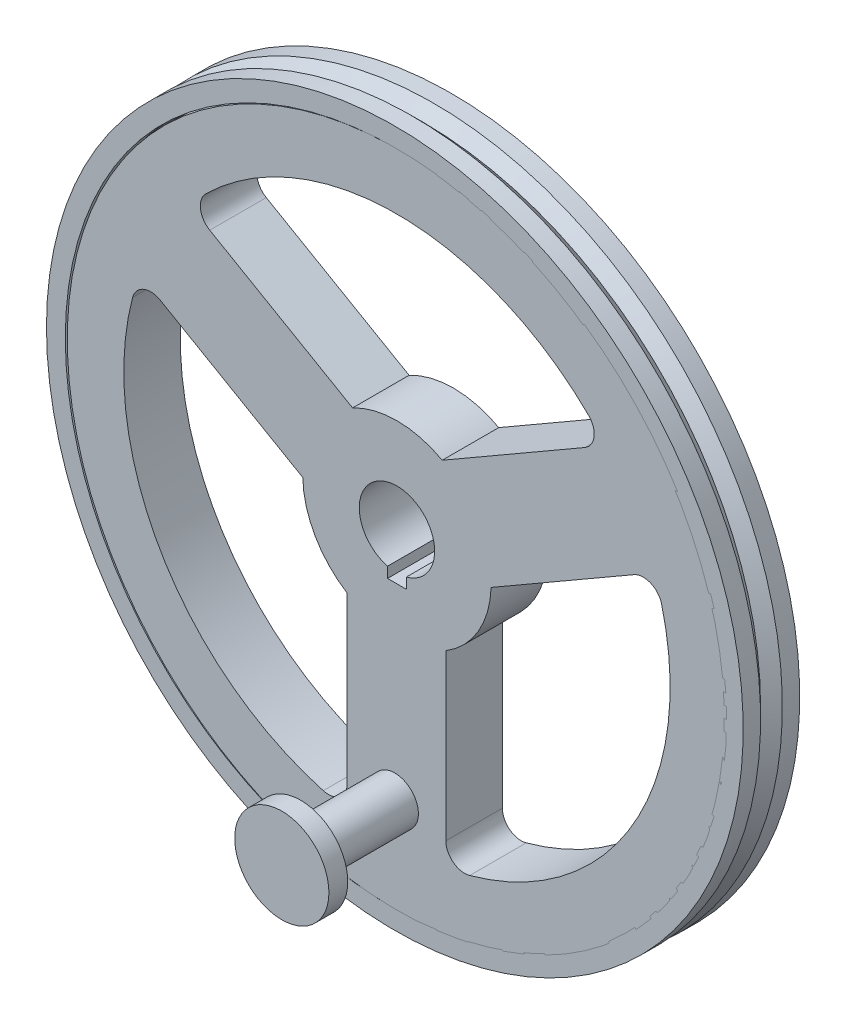
ISO-10303-21;
HEADER;
FILE_DESCRIPTION(('STEP AP214'),'2;1');
FILE_NAME('part.step','',(''),(''),'','','');
FILE_SCHEMA(('AUTOMOTIVE_DESIGN { 1 0 10303 214 1 1 1 1 }'));
ENDSEC;
DATA;
#1=APPLICATION_CONTEXT('core data for automotive mechanical design processes');
#2=APPLICATION_PROTOCOL_DEFINITION('international standard','automotive_design',2000,#1);
#3=PRODUCT_CONTEXT('',#1,'mechanical');
#4=PRODUCT('Part','Part','',(#3));
#5=PRODUCT_RELATED_PRODUCT_CATEGORY('part','',(#4));
#6=PRODUCT_DEFINITION_FORMATION('','',#4);
#7=PRODUCT_DEFINITION_CONTEXT('part definition',#1,'design');
#8=PRODUCT_DEFINITION('design','',#6,#7);
#9=PRODUCT_DEFINITION_SHAPE('','',#8);
#10=(LENGTH_UNIT() NAMED_UNIT(*) SI_UNIT(.MILLI.,.METRE.));
#11=(NAMED_UNIT(*) PLANE_ANGLE_UNIT() SI_UNIT($,.RADIAN.));
#12=(NAMED_UNIT(*) SI_UNIT($,.STERADIAN.) SOLID_ANGLE_UNIT());
#13=UNCERTAINTY_MEASURE_WITH_UNIT(LENGTH_MEASURE(1.E-05),#10,'distance_accuracy_value','');
#14=(GEOMETRIC_REPRESENTATION_CONTEXT(3) GLOBAL_UNCERTAINTY_ASSIGNED_CONTEXT((#13)) GLOBAL_UNIT_ASSIGNED_CONTEXT((#10,
#11,#12)) REPRESENTATION_CONTEXT('',''));
#15=CARTESIAN_POINT('',(0.,0.,0.));
#16=DIRECTION('',(0.,0.,1.));
#17=DIRECTION('',(1.,0.,0.));
#18=AXIS2_PLACEMENT_3D('',#15,#16,#17);
#19=CARTESIAN_POINT('',(0.,0.,0.));
#20=DIRECTION('',(0.,0.,-1.));
#21=DIRECTION('',(-1.,0.,0.));
#22=AXIS2_PLACEMENT_3D('',#19,#20,#21);
#23=CYLINDRICAL_SURFACE('',#22,174.92224870385);
#24=CARTESIAN_POINT('',(0.,0.,0.));
#25=DIRECTION('',(0.,0.,-1.));
#26=DIRECTION('',(-1.,0.,0.));
#27=AXIS2_PLACEMENT_3D('',#24,#25,#26);
#28=CIRCLE('',#27,174.92224870385);
#29=CARTESIAN_POINT('',(-174.92224870385,0.,0.));
#30=VERTEX_POINT('',#29);
#31=EDGE_CURVE('E81',#30,#30,#28,.T.);
#32=ORIENTED_EDGE('',*,*,#31,.T.);
#33=EDGE_LOOP('',(#32));
#34=FACE_BOUND('',#33,.T.);
#35=CARTESIAN_POINT('',(0.,0.,5.0777512961502));
#36=DIRECTION('',(0.,0.,-1.));
#37=DIRECTION('',(-1.,0.,0.));
#38=AXIS2_PLACEMENT_3D('',#35,#36,#37);
#39=CIRCLE('',#38,174.92224870385);
#40=CARTESIAN_POINT('',(-174.92224870385,0.,5.0777512961502));
#41=VERTEX_POINT('',#40);
#42=EDGE_CURVE('E11',#41,#41,#39,.T.);
#43=ORIENTED_EDGE('',*,*,#42,.F.);
#44=EDGE_LOOP('',(#43));
#45=FACE_BOUND('',#44,.T.);
#46=ADVANCED_FACE('F47',(#34,#45),#23,.F.);
#47=CARTESIAN_POINT('',(0.,0.,15.));
#48=DIRECTION('',(0.,0.,-1.));
#49=DIRECTION('',(-1.,0.,0.));
#50=AXIS2_PLACEMENT_3D('',#47,#48,#49);
#51=CONICAL_SURFACE('',#50,165.,0.785398163397449);
#52=ORIENTED_EDGE('',*,*,#42,.T.);
#53=EDGE_LOOP('',(#52));
#54=FACE_BOUND('',#53,.T.);
#55=CARTESIAN_POINT('',(0.,0.,15.));
#56=DIRECTION('',(0.,0.,-1.));
#57=DIRECTION('',(-1.,0.,0.));
#58=AXIS2_PLACEMENT_3D('',#55,#56,#57);
#59=CIRCLE('',#58,165.);
#60=CARTESIAN_POINT('',(-165.,0.,15.));
#61=VERTEX_POINT('',#60);
#62=EDGE_CURVE('E53',#61,#61,#59,.T.);
#63=ORIENTED_EDGE('',*,*,#62,.F.);
#64=EDGE_LOOP('',(#63));
#65=FACE_BOUND('',#64,.T.);
#66=ADVANCED_FACE('F131',(#54,#65),#51,.F.);
#67=CARTESIAN_POINT('',(0.,0.,24.9222487038498));
#68=DIRECTION('',(0.,0.,1.));
#69=DIRECTION('',(1.,0.,0.));
#70=AXIS2_PLACEMENT_3D('',#67,#68,#69);
#71=CONICAL_SURFACE('',#70,174.92224870385,0.785398163397449);
#72=ORIENTED_EDGE('',*,*,#62,.T.);
#73=EDGE_LOOP('',(#72));
#74=FACE_BOUND('',#73,.T.);
#75=CARTESIAN_POINT('',(0.,0.,24.9222487038498));
#76=DIRECTION('',(0.,0.,-1.));
#77=DIRECTION('',(-1.,0.,0.));
#78=AXIS2_PLACEMENT_3D('',#75,#76,#77);
#79=CIRCLE('',#78,174.92224870385);
#80=CARTESIAN_POINT('',(-174.92224870385,0.,24.9222487038498));
#81=VERTEX_POINT('',#80);
#82=EDGE_CURVE('E57',#81,#81,#79,.T.);
#83=ORIENTED_EDGE('',*,*,#82,.F.);
#84=EDGE_LOOP('',(#83));
#85=FACE_BOUND('',#84,.T.);
#86=ADVANCED_FACE('F125',(#74,#85),#71,.F.);
#87=CARTESIAN_POINT('',(0.,0.,0.));
#88=DIRECTION('',(0.,0.,-1.));
#89=DIRECTION('',(-1.,0.,0.));
#90=AXIS2_PLACEMENT_3D('',#87,#88,#89);
#91=CYLINDRICAL_SURFACE('',#90,174.92224870385);
#92=ORIENTED_EDGE('',*,*,#82,.T.);
#93=EDGE_LOOP('',(#92));
#94=FACE_BOUND('',#93,.T.);
#95=CARTESIAN_POINT('',(0.,0.,30.));
#96=DIRECTION('',(0.,0.,-1.));
#97=DIRECTION('',(-1.,0.,0.));
#98=AXIS2_PLACEMENT_3D('',#95,#96,#97);
#99=CIRCLE('',#98,174.92224870385);
#100=CARTESIAN_POINT('',(-174.92224870385,0.,30.));
#101=VERTEX_POINT('',#100);
#102=EDGE_CURVE('E61',#101,#101,#99,.T.);
#103=ORIENTED_EDGE('',*,*,#102,.F.);
#104=EDGE_LOOP('',(#103));
#105=FACE_BOUND('',#104,.T.);
#106=ADVANCED_FACE('F120',(#94,#105),#91,.F.);
#107=CARTESIAN_POINT('',(0.,174.92224870385,30.));
#108=DIRECTION('',(0.,0.,-1.));
#109=DIRECTION('',(-1.,0.,0.));
#110=AXIS2_PLACEMENT_3D('',#107,#108,#109);
#111=PLANE('',#110);
#112=CARTESIAN_POINT('',(0.,0.,30.));
#113=DIRECTION('',(0.,0.,-1.));
#114=DIRECTION('',(-1.,0.,0.));
#115=AXIS2_PLACEMENT_3D('',#112,#113,#114);
#116=CIRCLE('',#115,184.92224870385);
#117=CARTESIAN_POINT('',(-184.92224870385,0.,30.));
#118=VERTEX_POINT('',#117);
#119=EDGE_CURVE('E66',#118,#118,#116,.T.);
#120=ORIENTED_EDGE('',*,*,#119,.F.);
#121=EDGE_LOOP('',(#120));
#122=FACE_BOUND('',#121,.T.);
#123=ORIENTED_EDGE('',*,*,#102,.T.);
#124=EDGE_LOOP('',(#123));
#125=FACE_BOUND('',#124,.T.);
#126=ADVANCED_FACE('F114',(#122,#125),#111,.F.);
#127=CARTESIAN_POINT('',(0.,0.,0.));
#128=DIRECTION('',(0.,0.,-1.));
#129=DIRECTION('',(-1.,0.,0.));
#130=AXIS2_PLACEMENT_3D('',#127,#128,#129);
#131=CYLINDRICAL_SURFACE('',#130,184.92224870385);
#132=CARTESIAN_POINT('',(0.,0.,20.7801130801188));
#133=DIRECTION('',(0.,0.,-1.));
#134=DIRECTION('',(-1.,0.,0.));
#135=AXIS2_PLACEMENT_3D('',#132,#133,#134);
#136=CIRCLE('',#135,184.92224870385);
#137=CARTESIAN_POINT('',(-184.92224870385,0.,20.7801130801188));
#138=VERTEX_POINT('',#137);
#139=EDGE_CURVE('E69',#138,#138,#136,.T.);
#140=ORIENTED_EDGE('',*,*,#139,.F.);
#141=EDGE_LOOP('',(#140));
#142=FACE_BOUND('',#141,.T.);
#143=ORIENTED_EDGE('',*,*,#119,.T.);
#144=EDGE_LOOP('',(#143));
#145=FACE_BOUND('',#144,.T.);
#146=ADVANCED_FACE('F108',(#142,#145),#131,.T.);
#147=CARTESIAN_POINT('',(0.,0.,20.7801130801188));
#148=DIRECTION('',(0.,0.,1.));
#149=DIRECTION('',(1.,0.,0.));
#150=AXIS2_PLACEMENT_3D('',#147,#148,#149);
#151=CONICAL_SURFACE('',#150,184.92224870385,0.78539816339745);
#152=CARTESIAN_POINT('',(0.,0.,15.));
#153=DIRECTION('',(0.,0.,-1.));
#154=DIRECTION('',(-1.,0.,0.));
#155=AXIS2_PLACEMENT_3D('',#152,#153,#154);
#156=CIRCLE('',#155,179.142135623731);
#157=CARTESIAN_POINT('',(-179.142135623731,0.,15.));
#158=VERTEX_POINT('',#157);
#159=EDGE_CURVE('E72',#158,#158,#156,.T.);
#160=ORIENTED_EDGE('',*,*,#159,.F.);
#161=EDGE_LOOP('',(#160));
#162=FACE_BOUND('',#161,.T.);
#163=ORIENTED_EDGE('',*,*,#139,.T.);
#164=EDGE_LOOP('',(#163));
#165=FACE_BOUND('',#164,.T.);
#166=ADVANCED_FACE('F102',(#162,#165),#151,.T.);
#167=CARTESIAN_POINT('',(0.,0.,15.));
#168=DIRECTION('',(0.,0.,-1.));
#169=DIRECTION('',(-1.,0.,0.));
#170=AXIS2_PLACEMENT_3D('',#167,#168,#169);
#171=CONICAL_SURFACE('',#170,179.142135623731,0.785398163397449);
#172=CARTESIAN_POINT('',(0.,0.,9.21988691988115));
#173=DIRECTION('',(0.,0.,-1.));
#174=DIRECTION('',(-1.,0.,0.));
#175=AXIS2_PLACEMENT_3D('',#172,#173,#174);
#176=CIRCLE('',#175,184.92224870385);
#177=CARTESIAN_POINT('',(-184.92224870385,0.,9.21988691988115));
#178=VERTEX_POINT('',#177);
#179=EDGE_CURVE('E75',#178,#178,#176,.T.);
#180=ORIENTED_EDGE('',*,*,#179,.F.);
#181=EDGE_LOOP('',(#180));
#182=FACE_BOUND('',#181,.T.);
#183=ORIENTED_EDGE('',*,*,#159,.T.);
#184=EDGE_LOOP('',(#183));
#185=FACE_BOUND('',#184,.T.);
#186=ADVANCED_FACE('F96',(#182,#185),#171,.T.);
#187=CARTESIAN_POINT('',(0.,0.,0.));
#188=DIRECTION('',(0.,0.,-1.));
#189=DIRECTION('',(-1.,0.,0.));
#190=AXIS2_PLACEMENT_3D('',#187,#188,#189);
#191=CYLINDRICAL_SURFACE('',#190,184.92224870385);
#192=CARTESIAN_POINT('',(0.,0.,0.));
#193=DIRECTION('',(0.,0.,-1.));
#194=DIRECTION('',(-1.,0.,0.));
#195=AXIS2_PLACEMENT_3D('',#192,#193,#194);
#196=CIRCLE('',#195,184.92224870385);
#197=CARTESIAN_POINT('',(-184.92224870385,0.,0.));
#198=VERTEX_POINT('',#197);
#199=EDGE_CURVE('E78',#198,#198,#196,.T.);
#200=ORIENTED_EDGE('',*,*,#199,.F.);
#201=EDGE_LOOP('',(#200));
#202=FACE_BOUND('',#201,.T.);
#203=ORIENTED_EDGE('',*,*,#179,.T.);
#204=EDGE_LOOP('',(#203));
#205=FACE_BOUND('',#204,.T.);
#206=ADVANCED_FACE('F90',(#202,#205),#191,.T.);
#207=CARTESIAN_POINT('',(0.,184.92224870385,0.));
#208=DIRECTION('',(0.,0.,1.));
#209=DIRECTION('',(1.,0.,0.));
#210=AXIS2_PLACEMENT_3D('',#207,#208,#209);
#211=PLANE('',#210);
#212=ORIENTED_EDGE('',*,*,#31,.F.);
#213=EDGE_LOOP('',(#212));
#214=FACE_BOUND('',#213,.T.);
#215=ORIENTED_EDGE('',*,*,#199,.T.);
#216=EDGE_LOOP('',(#215));
#217=FACE_BOUND('',#216,.T.);
#218=ADVANCED_FACE('F87',(#214,#217),#211,.F.);
#219=CLOSED_SHELL('',(#46,#66,#86,#106,#126,#146,#166,#186,#206,#218));
#220=MANIFOLD_SOLID_BREP('B2',#219);
#221=CARTESIAN_POINT('',(13.490672325539,-23.3665298960969,30.));
#222=DIRECTION('',(0.5,-0.866025403784438,0.));
#223=DIRECTION('',(0.866025403784438,0.5,0.));
#224=AXIS2_PLACEMENT_3D('',#221,#222,#223);
#225=PLANE('',#224);
#226=DIRECTION('',(-0.866025403784438,-0.5,0.));
#227=VECTOR('',#226,1.);
#228=CARTESIAN_POINT('',(13.490672325539,-23.3665298960969,0.));
#229=LINE('',#228,#227);
#230=CARTESIAN_POINT('',(126.912912780176,42.1178311624782,0.));
#231=VERTEX_POINT('',#230);
#232=CARTESIAN_POINT('',(51.0971925496008,-1.65439532144968,0.));
#233=VERTEX_POINT('',#232);
#234=EDGE_CURVE('E455',#231,#233,#229,.T.);
#235=ORIENTED_EDGE('',*,*,#234,.F.);
#236=DIRECTION('',(0.,0.,-1.));
#237=VECTOR('',#236,1.);
#238=CARTESIAN_POINT('',(126.912912780176,42.1178311624782,30.));
#239=LINE('',#238,#237);
#240=CARTESIAN_POINT('',(126.912912780176,42.1178311624782,30.));
#241=VERTEX_POINT('',#240);
#242=EDGE_CURVE('E45',#241,#231,#239,.T.);
#243=ORIENTED_EDGE('',*,*,#242,.F.);
#244=DIRECTION('',(-0.866025403784438,-0.5,0.));
#245=VECTOR('',#244,1.);
#246=CARTESIAN_POINT('',(13.490672325539,-23.3665298960969,30.));
#247=LINE('',#246,#245);
#248=CARTESIAN_POINT('',(51.0971925496008,-1.65439532144968,30.));
#249=VERTEX_POINT('',#248);
#250=EDGE_CURVE('E575',#241,#249,#247,.T.);
#251=ORIENTED_EDGE('',*,*,#250,.T.);
#252=DIRECTION('',(0.,0.,-1.));
#253=VECTOR('',#252,1.);
#254=CARTESIAN_POINT('',(51.0971925496008,-1.65439532144968,30.));
#255=LINE('',#254,#253);
#256=EDGE_CURVE('E314',#249,#233,#255,.T.);
#257=ORIENTED_EDGE('',*,*,#256,.T.);
#258=EDGE_LOOP('',(#235,#243,#251,#257));
#259=FACE_BOUND('',#258,.T.);
#260=ADVANCED_FACE('F219',(#259),#225,.T.);
#261=CARTESIAN_POINT('',(131.912912780176,33.4575771246338,30.));
#262=DIRECTION('',(0.,0.,-1.));
#263=DIRECTION('',(-1.,0.,0.));
#264=AXIS2_PLACEMENT_3D('',#261,#262,#263);
#265=CYLINDRICAL_SURFACE('',#264,9.99999999999999);
#266=CARTESIAN_POINT('',(131.912912780176,33.4575771246338,0.));
#267=DIRECTION('',(0.,0.,1.));
#268=DIRECTION('',(1.,0.,0.));
#269=AXIS2_PLACEMENT_3D('',#266,#267,#268);
#270=CIRCLE('',#269,9.99999999999999);
#271=CARTESIAN_POINT('',(141.600938150278,35.9359161709029,0.));
#272=VERTEX_POINT('',#271);
#273=EDGE_CURVE('E458',#231,#272,#270,.F.);
#274=ORIENTED_EDGE('',*,*,#273,.T.);
#275=DIRECTION('',(0.,0.,-1.));
#276=VECTOR('',#275,1.);
#277=CARTESIAN_POINT('',(141.600938150278,35.9359161709029,30.));
#278=LINE('',#277,#276);
#279=CARTESIAN_POINT('',(141.600938150278,35.9359161709029,30.));
#280=VERTEX_POINT('',#279);
#281=EDGE_CURVE('E229',#280,#272,#278,.T.);
#282=ORIENTED_EDGE('',*,*,#281,.F.);
#283=CARTESIAN_POINT('',(131.912912780176,33.4575771246338,30.));
#284=DIRECTION('',(0.,0.,1.));
#285=DIRECTION('',(1.,0.,0.));
#286=AXIS2_PLACEMENT_3D('',#283,#284,#285);
#287=CIRCLE('',#286,9.99999999999999);
#288=EDGE_CURVE('E577',#241,#280,#287,.F.);
#289=ORIENTED_EDGE('',*,*,#288,.F.);
#290=ORIENTED_EDGE('',*,*,#242,.T.);
#291=EDGE_LOOP('',(#274,#282,#289,#290));
#292=FACE_BOUND('',#291,.T.);
#293=ADVANCED_FACE('F587',(#292),#265,.F.);
#294=CARTESIAN_POINT('',(1.12457028380035,0.,30.));
#295=DIRECTION('',(0.,0.,-1.));
#296=DIRECTION('',(-1.,0.,0.));
#297=AXIS2_PLACEMENT_3D('',#294,#295,#296);
#298=CYLINDRICAL_SURFACE('',#297,145.);
#299=CARTESIAN_POINT('',(1.12457028380035,0.,0.));
#300=DIRECTION('',(0.,0.,1.));
#301=DIRECTION('',(1.,0.,0.));
#302=AXIS2_PLACEMENT_3D('',#299,#300,#301);
#303=CIRCLE('',#302,145.);
#304=CARTESIAN_POINT('',(39.7379828367538,-139.764102583658,0.));
#305=VERTEX_POINT('',#304);
#306=EDGE_CURVE('E461',#305,#272,#303,.T.);
#307=ORIENTED_EDGE('',*,*,#306,.F.);
#308=DIRECTION('',(0.,0.,-1.));
#309=VECTOR('',#308,1.);
#310=CARTESIAN_POINT('',(39.7379828367538,-139.764102583658,30.));
#311=LINE('',#310,#309);
#312=CARTESIAN_POINT('',(39.7379828367538,-139.764102583658,30.));
#313=VERTEX_POINT('',#312);
#314=EDGE_CURVE('E389',#313,#305,#311,.T.);
#315=ORIENTED_EDGE('',*,*,#314,.F.);
#316=CARTESIAN_POINT('',(1.12457028380035,0.,30.));
#317=DIRECTION('',(0.,0.,1.));
#318=DIRECTION('',(1.,0.,0.));
#319=AXIS2_PLACEMENT_3D('',#316,#317,#318);
#320=CIRCLE('',#319,145.);
#321=EDGE_CURVE('E395',#313,#280,#320,.T.);
#322=ORIENTED_EDGE('',*,*,#321,.T.);
#323=ORIENTED_EDGE('',*,*,#281,.T.);
#324=EDGE_LOOP('',(#307,#315,#322,#323));
#325=FACE_BOUND('',#324,.T.);
#326=ADVANCED_FACE('F580',(#325),#298,.F.);
#327=CARTESIAN_POINT('',(37.0749888675846,-130.125198957199,30.));
#328=DIRECTION('',(0.,0.,-1.));
#329=DIRECTION('',(-1.,0.,0.));
#330=AXIS2_PLACEMENT_3D('',#327,#328,#329);
#331=CYLINDRICAL_SURFACE('',#330,10.);
#332=CARTESIAN_POINT('',(37.0749888675846,-130.125198957199,0.));
#333=DIRECTION('',(0.,0.,1.));
#334=DIRECTION('',(1.,0.,0.));
#335=AXIS2_PLACEMENT_3D('',#332,#333,#334);
#336=CIRCLE('',#335,10.);
#337=CARTESIAN_POINT('',(27.0749888675847,-130.125198957199,0.));
#338=VERTEX_POINT('',#337);
#339=EDGE_CURVE('E384',#338,#305,#336,.T.);
#340=ORIENTED_EDGE('',*,*,#339,.F.);
#341=DIRECTION('',(0.,0.,-1.));
#342=VECTOR('',#341,1.);
#343=CARTESIAN_POINT('',(27.0749888675847,-130.125198957199,30.));
#344=LINE('',#343,#342);
#345=CARTESIAN_POINT('',(27.0749888675847,-130.125198957199,30.));
#346=VERTEX_POINT('',#345);
#347=EDGE_CURVE('E379',#346,#338,#344,.T.);
#348=ORIENTED_EDGE('',*,*,#347,.F.);
#349=CARTESIAN_POINT('',(37.0749888675846,-130.125198957199,30.));
#350=DIRECTION('',(0.,0.,1.));
#351=DIRECTION('',(1.,0.,0.));
#352=AXIS2_PLACEMENT_3D('',#349,#350,#351);
#353=CIRCLE('',#352,10.);
#354=EDGE_CURVE('E382',#346,#313,#353,.T.);
#355=ORIENTED_EDGE('',*,*,#354,.T.);
#356=ORIENTED_EDGE('',*,*,#314,.T.);
#357=EDGE_LOOP('',(#340,#348,#355,#356));
#358=FACE_BOUND('',#357,.T.);
#359=ADVANCED_FACE('F381',(#358),#331,.F.);
#360=CARTESIAN_POINT('',(27.0749888675847,0.,30.));
#361=DIRECTION('',(1.,0.,0.));
#362=DIRECTION('',(0.,1.,0.));
#363=AXIS2_PLACEMENT_3D('',#360,#361,#362);
#364=PLANE('',#363);
#365=DIRECTION('',(0.,-1.,0.));
#366=VECTOR('',#365,1.);
#367=CARTESIAN_POINT('',(27.0749888675847,0.,0.));
#368=LINE('',#367,#366);
#369=CARTESIAN_POINT('',(27.0749888675847,-42.7384578023867,0.));
#370=VERTEX_POINT('',#369);
#371=EDGE_CURVE('E465',#370,#338,#368,.T.);
#372=ORIENTED_EDGE('',*,*,#371,.F.);
#373=DIRECTION('',(0.,0.,-1.));
#374=VECTOR('',#373,1.);
#375=CARTESIAN_POINT('',(27.0749888675847,-42.7384578023867,30.));
#376=LINE('',#375,#374);
#377=CARTESIAN_POINT('',(27.0749888675847,-42.7384578023867,30.));
#378=VERTEX_POINT('',#377);
#379=EDGE_CURVE('E307',#378,#370,#376,.T.);
#380=ORIENTED_EDGE('',*,*,#379,.F.);
#381=DIRECTION('',(0.,-1.,0.));
#382=VECTOR('',#381,1.);
#383=CARTESIAN_POINT('',(27.0749888675847,0.,30.));
#384=LINE('',#383,#382);
#385=EDGE_CURVE('E393',#378,#346,#384,.T.);
#386=ORIENTED_EDGE('',*,*,#385,.T.);
#387=ORIENTED_EDGE('',*,*,#347,.T.);
#388=EDGE_LOOP('',(#372,#380,#386,#387));
#389=FACE_BOUND('',#388,.T.);
#390=ADVANCED_FACE('F397',(#389),#364,.T.);
#391=CARTESIAN_POINT('',(1.12457028380035,0.,30.));
#392=DIRECTION('',(0.,0.,-1.));
#393=DIRECTION('',(-1.,0.,0.));
#394=AXIS2_PLACEMENT_3D('',#391,#392,#393);
#395=CYLINDRICAL_SURFACE('',#394,20.);
#396=CARTESIAN_POINT('',(1.12457028380035,0.,0.));
#397=DIRECTION('',(0.,0.,1.));
#398=DIRECTION('',(1.,0.,0.));
#399=AXIS2_PLACEMENT_3D('',#396,#397,#398);
#400=CIRCLE('',#399,20.);
#401=CARTESIAN_POINT('',(6.12457028380035,-19.3649167310371,0.));
#402=VERTEX_POINT('',#401);
#403=CARTESIAN_POINT('',(-3.87542971619965,-19.3649167310371,0.));
#404=VERTEX_POINT('',#403);
#405=EDGE_CURVE('E440',#402,#404,#400,.T.);
#406=ORIENTED_EDGE('',*,*,#405,.F.);
#407=DIRECTION('',(0.,0.,-1.));
#408=VECTOR('',#407,1.);
#409=CARTESIAN_POINT('',(6.12457028380035,-19.3649167310371,30.));
#410=LINE('',#409,#408);
#411=CARTESIAN_POINT('',(6.12457028380035,-19.3649167310371,30.));
#412=VERTEX_POINT('',#411);
#413=EDGE_CURVE('E471',#412,#402,#410,.T.);
#414=ORIENTED_EDGE('',*,*,#413,.F.);
#415=CARTESIAN_POINT('',(1.12457028380035,0.,30.));
#416=DIRECTION('',(0.,0.,1.));
#417=DIRECTION('',(1.,0.,0.));
#418=AXIS2_PLACEMENT_3D('',#415,#416,#417);
#419=CIRCLE('',#418,20.);
#420=CARTESIAN_POINT('',(-3.87542971619965,-19.3649167310371,30.));
#421=VERTEX_POINT('',#420);
#422=EDGE_CURVE('E561',#412,#421,#419,.T.);
#423=ORIENTED_EDGE('',*,*,#422,.T.);
#424=DIRECTION('',(0.,0.,-1.));
#425=VECTOR('',#424,1.);
#426=CARTESIAN_POINT('',(-3.87542971619965,-19.3649167310371,30.));
#427=LINE('',#426,#425);
#428=EDGE_CURVE('E475',#421,#404,#427,.T.);
#429=ORIENTED_EDGE('',*,*,#428,.T.);
#430=EDGE_LOOP('',(#406,#414,#423,#429));
#431=FACE_BOUND('',#430,.T.);
#432=ADVANCED_FACE('F615',(#431),#395,.F.);
#433=CARTESIAN_POINT('',(6.12457028380033,0.,30.));
#434=DIRECTION('',(1.,0.,0.));
#435=DIRECTION('',(0.,1.,0.));
#436=AXIS2_PLACEMENT_3D('',#433,#434,#435);
#437=PLANE('',#436);
#438=DIRECTION('',(0.,-1.,0.));
#439=VECTOR('',#438,1.);
#440=CARTESIAN_POINT('',(6.12457028380033,0.,0.));
#441=LINE('',#440,#439);
#442=CARTESIAN_POINT('',(6.12457028380035,-25.,0.));
#443=VERTEX_POINT('',#442);
#444=EDGE_CURVE('E443',#402,#443,#441,.T.);
#445=ORIENTED_EDGE('',*,*,#444,.T.);
#446=DIRECTION('',(0.,0.,-1.));
#447=VECTOR('',#446,1.);
#448=CARTESIAN_POINT('',(6.12457028380035,-25.,30.));
#449=LINE('',#448,#447);
#450=CARTESIAN_POINT('',(6.12457028380035,-25.,30.));
#451=VERTEX_POINT('',#450);
#452=EDGE_CURVE('E480',#451,#443,#449,.T.);
#453=ORIENTED_EDGE('',*,*,#452,.F.);
#454=DIRECTION('',(0.,-1.,0.));
#455=VECTOR('',#454,1.);
#456=CARTESIAN_POINT('',(6.12457028380033,0.,30.));
#457=LINE('',#456,#455);
#458=EDGE_CURVE('E564',#412,#451,#457,.T.);
#459=ORIENTED_EDGE('',*,*,#458,.F.);
#460=ORIENTED_EDGE('',*,*,#413,.T.);
#461=EDGE_LOOP('',(#445,#453,#459,#460));
#462=FACE_BOUND('',#461,.T.);
#463=ADVANCED_FACE('F611',(#462),#437,.F.);
#464=CARTESIAN_POINT('',(0.,-25.,30.));
#465=DIRECTION('',(0.,-1.,0.));
#466=DIRECTION('',(1.,0.,0.));
#467=AXIS2_PLACEMENT_3D('',#464,#465,#466);
#468=PLANE('',#467);
#469=DIRECTION('',(-1.,0.,0.));
#470=VECTOR('',#469,1.);
#471=CARTESIAN_POINT('',(0.,-25.,0.));
#472=LINE('',#471,#470);
#473=CARTESIAN_POINT('',(-3.87542971619965,-25.,0.));
#474=VERTEX_POINT('',#473);
#475=EDGE_CURVE('E446',#443,#474,#472,.T.);
#476=ORIENTED_EDGE('',*,*,#475,.T.);
#477=DIRECTION('',(0.,0.,-1.));
#478=VECTOR('',#477,1.);
#479=CARTESIAN_POINT('',(-3.87542971619965,-25.,30.));
#480=LINE('',#479,#478);
#481=CARTESIAN_POINT('',(-3.87542971619965,-25.,30.));
#482=VERTEX_POINT('',#481);
#483=EDGE_CURVE('E477',#482,#474,#480,.T.);
#484=ORIENTED_EDGE('',*,*,#483,.F.);
#485=DIRECTION('',(-1.,0.,0.));
#486=VECTOR('',#485,1.);
#487=CARTESIAN_POINT('',(0.,-25.,30.));
#488=LINE('',#487,#486);
#489=EDGE_CURVE('E567',#451,#482,#488,.T.);
#490=ORIENTED_EDGE('',*,*,#489,.F.);
#491=ORIENTED_EDGE('',*,*,#452,.T.);
#492=EDGE_LOOP('',(#476,#484,#490,#491));
#493=FACE_BOUND('',#492,.T.);
#494=ADVANCED_FACE('F607',(#493),#468,.F.);
#495=CARTESIAN_POINT('',(-93.2447127033972,96.537238558404,30.));
#496=DIRECTION('',(0.,0.,-1.));
#497=DIRECTION('',(-1.,0.,0.));
#498=AXIS2_PLACEMENT_3D('',#495,#496,#497);
#499=CYLINDRICAL_SURFACE('',#498,9.99999999999999);
#500=CARTESIAN_POINT('',(-93.2447127033972,96.537238558404,0.));
#501=DIRECTION('',(0.,0.,1.));
#502=DIRECTION('',(1.,0.,0.));
#503=AXIS2_PLACEMENT_3D('',#500,#501,#502);
#504=CIRCLE('',#503,9.99999999999999);
#505=CARTESIAN_POINT('',(-100.235029961708,103.688145118286,0.));
#506=VERTEX_POINT('',#505);
#507=CARTESIAN_POINT('',(-98.2447127033972,87.8769845205596,0.));
#508=VERTEX_POINT('',#507);
#509=EDGE_CURVE('E422',#506,#508,#504,.T.);
#510=ORIENTED_EDGE('',*,*,#509,.F.);
#511=DIRECTION('',(0.,0.,-1.));
#512=VECTOR('',#511,1.);
#513=CARTESIAN_POINT('',(-100.235029961708,103.688145118286,30.));
#514=LINE('',#513,#512);
#515=CARTESIAN_POINT('',(-100.235029961708,103.688145118286,30.));
#516=VERTEX_POINT('',#515);
#517=EDGE_CURVE('E478',#516,#506,#514,.T.);
#518=ORIENTED_EDGE('',*,*,#517,.F.);
#519=CARTESIAN_POINT('',(-93.2447127033972,96.537238558404,30.));
#520=DIRECTION('',(0.,0.,1.));
#521=DIRECTION('',(1.,0.,0.));
#522=AXIS2_PLACEMENT_3D('',#519,#520,#521);
#523=CIRCLE('',#522,9.99999999999999);
#524=CARTESIAN_POINT('',(-98.2447127033972,87.8769845205596,30.));
#525=VERTEX_POINT('',#524);
#526=EDGE_CURVE('E544',#516,#525,#523,.T.);
#527=ORIENTED_EDGE('',*,*,#526,.T.);
#528=DIRECTION('',(0.,0.,-1.));
#529=VECTOR('',#528,1.);
#530=CARTESIAN_POINT('',(-98.2447127033972,87.8769845205596,30.));
#531=LINE('',#530,#529);
#532=EDGE_CURVE('E484',#525,#508,#531,.T.);
#533=ORIENTED_EDGE('',*,*,#532,.T.);
#534=EDGE_LOOP('',(#510,#518,#527,#533));
#535=FACE_BOUND('',#534,.T.);
#536=ADVANCED_FACE('F610',(#535),#499,.F.);
#537=CARTESIAN_POINT('',(1.12457028380035,0.,30.));
#538=DIRECTION('',(0.,0.,-1.));
#539=DIRECTION('',(-1.,0.,0.));
#540=AXIS2_PLACEMENT_3D('',#537,#538,#539);
#541=CYLINDRICAL_SURFACE('',#540,145.);
#542=CARTESIAN_POINT('',(1.12457028380035,0.,0.));
#543=DIRECTION('',(0.,0.,1.));
#544=DIRECTION('',(1.,0.,0.));
#545=AXIS2_PLACEMENT_3D('',#542,#543,#544);
#546=CIRCLE('',#545,145.);
#547=CARTESIAN_POINT('',(102.857127381906,103.322247489496,0.));
#548=VERTEX_POINT('',#547);
#549=EDGE_CURVE('E425',#548,#506,#546,.T.);
#550=ORIENTED_EDGE('',*,*,#549,.F.);
#551=DIRECTION('',(0.,0.,-1.));
#552=VECTOR('',#551,1.);
#553=CARTESIAN_POINT('',(102.857127381906,103.322247489496,30.));
#554=LINE('',#553,#552);
#555=CARTESIAN_POINT('',(102.857127381906,103.322247489496,30.));
#556=VERTEX_POINT('',#555);
#557=EDGE_CURVE('E492',#556,#548,#554,.T.);
#558=ORIENTED_EDGE('',*,*,#557,.F.);
#559=CARTESIAN_POINT('',(1.12457028380035,0.,30.));
#560=DIRECTION('',(0.,0.,1.));
#561=DIRECTION('',(1.,0.,0.));
#562=AXIS2_PLACEMENT_3D('',#559,#560,#561);
#563=CIRCLE('',#562,145.);
#564=EDGE_CURVE('E547',#556,#516,#563,.T.);
#565=ORIENTED_EDGE('',*,*,#564,.T.);
#566=ORIENTED_EDGE('',*,*,#517,.T.);
#567=EDGE_LOOP('',(#550,#558,#565,#566));
#568=FACE_BOUND('',#567,.T.);
#569=ADVANCED_FACE('F634',(#568),#541,.F.);
#570=CARTESIAN_POINT('',(95.8410889613471,96.196575248841,30.));
#571=DIRECTION('',(0.,0.,-1.));
#572=DIRECTION('',(-1.,0.,0.));
#573=AXIS2_PLACEMENT_3D('',#570,#571,#572);
#574=CYLINDRICAL_SURFACE('',#573,10.);
#575=CARTESIAN_POINT('',(95.8410889613471,96.196575248841,0.));
#576=DIRECTION('',(0.,0.,1.));
#577=DIRECTION('',(1.,0.,0.));
#578=AXIS2_PLACEMENT_3D('',#575,#576,#577);
#579=CIRCLE('',#578,10.);
#580=CARTESIAN_POINT('',(100.841088961347,87.5363212109966,0.));
#581=VERTEX_POINT('',#580);
#582=EDGE_CURVE('E428',#581,#548,#579,.T.);
#583=ORIENTED_EDGE('',*,*,#582,.F.);
#584=DIRECTION('',(0.,0.,-1.));
#585=VECTOR('',#584,1.);
#586=CARTESIAN_POINT('',(100.841088961347,87.5363212109966,30.));
#587=LINE('',#586,#585);
#588=CARTESIAN_POINT('',(100.841088961347,87.5363212109966,30.));
#589=VERTEX_POINT('',#588);
#590=EDGE_CURVE('E490',#589,#581,#587,.T.);
#591=ORIENTED_EDGE('',*,*,#590,.F.);
#592=CARTESIAN_POINT('',(95.8410889613471,96.196575248841,30.));
#593=DIRECTION('',(0.,0.,1.));
#594=DIRECTION('',(1.,0.,0.));
#595=AXIS2_PLACEMENT_3D('',#592,#593,#594);
#596=CIRCLE('',#595,10.);
#597=EDGE_CURVE('E550',#589,#556,#596,.T.);
#598=ORIENTED_EDGE('',*,*,#597,.T.);
#599=ORIENTED_EDGE('',*,*,#557,.T.);
#600=EDGE_LOOP('',(#583,#591,#598,#599));
#601=FACE_BOUND('',#600,.T.);
#602=ADVANCED_FACE('F630',(#601),#574,.F.);
#603=CARTESIAN_POINT('',(-12.6940667209421,21.9867685153409,30.));
#604=DIRECTION('',(-0.5,0.866025403784439,0.));
#605=DIRECTION('',(-0.866025403784439,-0.5,0.));
#606=AXIS2_PLACEMENT_3D('',#603,#604,#605);
#607=PLANE('',#606);
#608=DIRECTION('',(0.866025403784439,0.5,0.));
#609=VECTOR('',#608,1.);
#610=CARTESIAN_POINT('',(-12.6940667209421,21.9867685153409,0.));
#611=LINE('',#610,#609);
#612=CARTESIAN_POINT('',(25.1619511673443,43.8429506335903,0.));
#613=VERTEX_POINT('',#612);
#614=EDGE_CURVE('E431',#613,#581,#611,.T.);
#615=ORIENTED_EDGE('',*,*,#614,.F.);
#616=DIRECTION('',(0.,0.,-1.));
#617=VECTOR('',#616,1.);
#618=CARTESIAN_POINT('',(25.1619511673443,43.8429506335903,30.));
#619=LINE('',#618,#617);
#620=CARTESIAN_POINT('',(25.1619511673443,43.8429506335903,30.));
#621=VERTEX_POINT('',#620);
#622=EDGE_CURVE('E488',#621,#613,#619,.T.);
#623=ORIENTED_EDGE('',*,*,#622,.F.);
#624=DIRECTION('',(0.866025403784439,0.5,0.));
#625=VECTOR('',#624,1.);
#626=CARTESIAN_POINT('',(-12.6940667209421,21.9867685153409,30.));
#627=LINE('',#626,#625);
#628=EDGE_CURVE('E553',#621,#589,#627,.T.);
#629=ORIENTED_EDGE('',*,*,#628,.T.);
#630=ORIENTED_EDGE('',*,*,#590,.T.);
#631=EDGE_LOOP('',(#615,#623,#629,#630));
#632=FACE_BOUND('',#631,.T.);
#633=ADVANCED_FACE('F626',(#632),#607,.T.);
#634=CARTESIAN_POINT('',(1.12457028380035,0.,30.));
#635=DIRECTION('',(0.,0.,-1.));
#636=DIRECTION('',(-1.,0.,0.));
#637=AXIS2_PLACEMENT_3D('',#634,#635,#636);
#638=CYLINDRICAL_SURFACE('',#637,50.);
#639=CARTESIAN_POINT('',(1.12457028380035,0.,0.));
#640=DIRECTION('',(0.,0.,1.));
#641=DIRECTION('',(1.,0.,0.));
#642=AXIS2_PLACEMENT_3D('',#639,#640,#641);
#643=CIRCLE('',#642,50.);
#644=CARTESIAN_POINT('',(-22.4289924728222,44.1047580366318,0.));
#645=VERTEX_POINT('',#644);
#646=EDGE_CURVE('E434',#613,#645,#643,.T.);
#647=ORIENTED_EDGE('',*,*,#646,.T.);
#648=DIRECTION('',(0.,0.,-1.));
#649=VECTOR('',#648,1.);
#650=CARTESIAN_POINT('',(-22.4289924728222,44.1047580366318,30.));
#651=LINE('',#650,#649);
#652=CARTESIAN_POINT('',(-22.4289924728222,44.1047580366318,30.));
#653=VERTEX_POINT('',#652);
#654=EDGE_CURVE('E486',#653,#645,#651,.T.);
#655=ORIENTED_EDGE('',*,*,#654,.F.);
#656=CARTESIAN_POINT('',(1.12457028380035,0.,30.));
#657=DIRECTION('',(0.,0.,1.));
#658=DIRECTION('',(1.,0.,0.));
#659=AXIS2_PLACEMENT_3D('',#656,#657,#658);
#660=CIRCLE('',#659,50.);
#661=EDGE_CURVE('E556',#621,#653,#660,.T.);
#662=ORIENTED_EDGE('',*,*,#661,.F.);
#663=ORIENTED_EDGE('',*,*,#622,.T.);
#664=EDGE_LOOP('',(#647,#655,#662,#663));
#665=FACE_BOUND('',#664,.T.);
#666=ADVANCED_FACE('F623',(#665),#638,.T.);
#667=CARTESIAN_POINT('',(-12.6940667209421,-21.9867685153409,30.));
#668=DIRECTION('',(-0.5,-0.866025403784439,0.));
#669=DIRECTION('',(0.866025403784439,-0.5,0.));
#670=AXIS2_PLACEMENT_3D('',#667,#668,#669);
#671=PLANE('',#670);
#672=DIRECTION('',(-0.866025403784439,0.5,0.));
#673=VECTOR('',#672,1.);
#674=CARTESIAN_POINT('',(-12.6940667209421,-21.9867685153409,0.));
#675=LINE('',#674,#673);
#676=CARTESIAN_POINT('',(-48.8632291835279,-1.10449283120368,0.));
#677=VERTEX_POINT('',#676);
#678=CARTESIAN_POINT('',(-124.542366977531,42.5888777462026,0.));
#679=VERTEX_POINT('',#678);
#680=EDGE_CURVE('E403',#677,#679,#675,.T.);
#681=ORIENTED_EDGE('',*,*,#680,.F.);
#682=DIRECTION('',(0.,0.,-1.));
#683=VECTOR('',#682,1.);
#684=CARTESIAN_POINT('',(-48.8632291835279,-1.10449283120368,30.));
#685=LINE('',#684,#683);
#686=CARTESIAN_POINT('',(-48.8632291835279,-1.10449283120368,30.));
#687=VERTEX_POINT('',#686);
#688=EDGE_CURVE('E223',#687,#677,#685,.T.);
#689=ORIENTED_EDGE('',*,*,#688,.F.);
#690=DIRECTION('',(-0.866025403784439,0.5,0.));
#691=VECTOR('',#690,1.);
#692=CARTESIAN_POINT('',(-12.6940667209421,-21.9867685153409,30.));
#693=LINE('',#692,#691);
#694=CARTESIAN_POINT('',(-124.542366977531,42.5888777462026,30.));
#695=VERTEX_POINT('',#694);
#696=EDGE_CURVE('E469',#687,#695,#693,.T.);
#697=ORIENTED_EDGE('',*,*,#696,.T.);
#698=DIRECTION('',(0.,0.,-1.));
#699=VECTOR('',#698,1.);
#700=CARTESIAN_POINT('',(-124.542366977531,42.5888777462026,30.));
#701=LINE('',#700,#699);
#702=EDGE_CURVE('E399',#695,#679,#701,.T.);
#703=ORIENTED_EDGE('',*,*,#702,.T.);
#704=EDGE_LOOP('',(#681,#689,#697,#703));
#705=FACE_BOUND('',#704,.T.);
#706=ADVANCED_FACE('F221',(#705),#671,.T.);
#707=CARTESIAN_POINT('',(1.12457028380035,0.,30.));
#708=DIRECTION('',(0.,0.,-1.));
#709=DIRECTION('',(-1.,0.,0.));
#710=AXIS2_PLACEMENT_3D('',#707,#708,#709);
#711=CYLINDRICAL_SURFACE('',#710,50.);
#712=CARTESIAN_POINT('',(1.12457028380035,0.,0.));
#713=DIRECTION('',(0.,0.,1.));
#714=DIRECTION('',(1.,0.,0.));
#715=AXIS2_PLACEMENT_3D('',#712,#713,#714);
#716=CIRCLE('',#715,50.);
#717=CARTESIAN_POINT('',(-25.2944892253773,-42.4503627151822,0.));
#718=VERTEX_POINT('',#717);
#719=EDGE_CURVE('E406',#677,#718,#716,.T.);
#720=ORIENTED_EDGE('',*,*,#719,.T.);
#721=DIRECTION('',(0.,0.,-1.));
#722=VECTOR('',#721,1.);
#723=CARTESIAN_POINT('',(-25.2944892253773,-42.4503627151822,30.));
#724=LINE('',#723,#722);
#725=CARTESIAN_POINT('',(-25.2944892253773,-42.4503627151822,30.));
#726=VERTEX_POINT('',#725);
#727=EDGE_CURVE('E501',#726,#718,#724,.T.);
#728=ORIENTED_EDGE('',*,*,#727,.F.);
#729=CARTESIAN_POINT('',(1.12457028380035,0.,30.));
#730=DIRECTION('',(0.,0.,1.));
#731=DIRECTION('',(1.,0.,0.));
#732=AXIS2_PLACEMENT_3D('',#729,#730,#731);
#733=CIRCLE('',#732,50.);
#734=EDGE_CURVE('E509',#687,#726,#733,.T.);
#735=ORIENTED_EDGE('',*,*,#734,.F.);
#736=ORIENTED_EDGE('',*,*,#688,.T.);
#737=EDGE_LOOP('',(#720,#728,#735,#736));
#738=FACE_BOUND('',#737,.T.);
#739=ADVANCED_FACE('F508',(#738),#711,.T.);
#740=CARTESIAN_POINT('',(-25.2944892253773,0.,30.));
#741=DIRECTION('',(-1.,0.,0.));
#742=DIRECTION('',(0.,0.,1.));
#743=AXIS2_PLACEMENT_3D('',#740,#741,#742);
#744=PLANE('',#743);
#745=DIRECTION('',(0.,1.,0.));
#746=VECTOR('',#745,1.);
#747=CARTESIAN_POINT('',(-25.2944892253773,0.,0.));
#748=LINE('',#747,#746);
#749=CARTESIAN_POINT('',(-25.2944892253773,-129.994815683038,0.));
#750=VERTEX_POINT('',#749);
#751=EDGE_CURVE('E410',#750,#718,#748,.T.);
#752=ORIENTED_EDGE('',*,*,#751,.F.);
#753=DIRECTION('',(0.,0.,-1.));
#754=VECTOR('',#753,1.);
#755=CARTESIAN_POINT('',(-25.2944892253773,-129.994815683038,30.));
#756=LINE('',#755,#754);
#757=CARTESIAN_POINT('',(-25.2944892253773,-129.994815683038,30.));
#758=VERTEX_POINT('',#757);
#759=EDGE_CURVE('E500',#758,#750,#756,.T.);
#760=ORIENTED_EDGE('',*,*,#759,.F.);
#761=DIRECTION('',(0.,1.,0.));
#762=VECTOR('',#761,1.);
#763=CARTESIAN_POINT('',(-25.2944892253773,0.,30.));
#764=LINE('',#763,#762);
#765=EDGE_CURVE('E532',#758,#726,#764,.T.);
#766=ORIENTED_EDGE('',*,*,#765,.T.);
#767=ORIENTED_EDGE('',*,*,#727,.T.);
#768=EDGE_LOOP('',(#752,#760,#766,#767));
#769=FACE_BOUND('',#768,.T.);
#770=ADVANCED_FACE('F530',(#769),#744,.T.);
#771=CARTESIAN_POINT('',(-35.2944892253773,-129.994815683038,30.));
#772=DIRECTION('',(0.,0.,-1.));
#773=DIRECTION('',(-1.,0.,0.));
#774=AXIS2_PLACEMENT_3D('',#771,#772,#773);
#775=CYLINDRICAL_SURFACE('',#774,10.);
#776=CARTESIAN_POINT('',(-35.2944892253773,-129.994815683038,0.));
#777=DIRECTION('',(0.,0.,1.));
#778=DIRECTION('',(1.,0.,0.));
#779=AXIS2_PLACEMENT_3D('',#776,#777,#778);
#780=CIRCLE('',#779,10.);
#781=CARTESIAN_POINT('',(-37.9921973371683,-139.624061289189,0.));
#782=VERTEX_POINT('',#781);
#783=EDGE_CURVE('E413',#750,#782,#780,.F.);
#784=ORIENTED_EDGE('',*,*,#783,.T.);
#785=DIRECTION('',(0.,0.,-1.));
#786=VECTOR('',#785,1.);
#787=CARTESIAN_POINT('',(-37.9921973371683,-139.624061289189,30.));
#788=LINE('',#787,#786);
#789=CARTESIAN_POINT('',(-37.9921973371683,-139.624061289189,30.));
#790=VERTEX_POINT('',#789);
#791=EDGE_CURVE('E498',#790,#782,#788,.T.);
#792=ORIENTED_EDGE('',*,*,#791,.F.);
#793=CARTESIAN_POINT('',(-35.2944892253773,-129.994815683038,30.));
#794=DIRECTION('',(0.,0.,1.));
#795=DIRECTION('',(1.,0.,0.));
#796=AXIS2_PLACEMENT_3D('',#793,#794,#795);
#797=CIRCLE('',#796,10.);
#798=EDGE_CURVE('E533',#758,#790,#797,.F.);
#799=ORIENTED_EDGE('',*,*,#798,.F.);
#800=ORIENTED_EDGE('',*,*,#759,.T.);
#801=EDGE_LOOP('',(#784,#792,#799,#800));
#802=FACE_BOUND('',#801,.T.);
#803=ADVANCED_FACE('F529',(#802),#775,.F.);
#804=CARTESIAN_POINT('',(1.12457028380035,0.,30.));
#805=DIRECTION('',(0.,0.,-1.));
#806=DIRECTION('',(-1.,0.,0.));
#807=AXIS2_PLACEMENT_3D('',#804,#805,#806);
#808=CYLINDRICAL_SURFACE('',#807,145.);
#809=CARTESIAN_POINT('',(1.12457028380035,0.,0.));
#810=DIRECTION('',(0.,0.,1.));
#811=DIRECTION('',(1.,0.,0.));
#812=AXIS2_PLACEMENT_3D('',#809,#810,#811);
#813=CIRCLE('',#812,145.);
#814=CARTESIAN_POINT('',(-139.221399367259,36.4418550941625,0.));
#815=VERTEX_POINT('',#814);
#816=EDGE_CURVE('E416',#815,#782,#813,.T.);
#817=ORIENTED_EDGE('',*,*,#816,.F.);
#818=DIRECTION('',(0.,0.,-1.));
#819=VECTOR('',#818,1.);
#820=CARTESIAN_POINT('',(-139.221399367259,36.4418550941625,30.));
#821=LINE('',#820,#819);
#822=CARTESIAN_POINT('',(-139.221399367259,36.4418550941625,30.));
#823=VERTEX_POINT('',#822);
#824=EDGE_CURVE('E496',#823,#815,#821,.T.);
#825=ORIENTED_EDGE('',*,*,#824,.F.);
#826=CARTESIAN_POINT('',(1.12457028380035,0.,30.));
#827=DIRECTION('',(0.,0.,1.));
#828=DIRECTION('',(1.,0.,0.));
#829=AXIS2_PLACEMENT_3D('',#826,#827,#828);
#830=CIRCLE('',#829,145.);
#831=EDGE_CURVE('E526',#823,#790,#830,.T.);
#832=ORIENTED_EDGE('',*,*,#831,.T.);
#833=ORIENTED_EDGE('',*,*,#791,.T.);
#834=EDGE_LOOP('',(#817,#825,#832,#833));
#835=FACE_BOUND('',#834,.T.);
#836=ADVANCED_FACE('F522',(#835),#808,.F.);
#837=CARTESIAN_POINT('',(1.12457028380035,0.,30.));
#838=DIRECTION('',(0.,0.,-1.));
#839=DIRECTION('',(-1.,0.,0.));
#840=AXIS2_PLACEMENT_3D('',#837,#838,#839);
#841=CYLINDRICAL_SURFACE('',#840,175.);
#842=CARTESIAN_POINT('',(1.12457028380035,0.,30.));
#843=DIRECTION('',(0.,0.,1.));
#844=DIRECTION('',(1.,0.,0.));
#845=AXIS2_PLACEMENT_3D('',#842,#843,#844);
#846=CIRCLE('',#845,175.);
#847=CARTESIAN_POINT('',(176.1245702838,0.,30.));
#848=VERTEX_POINT('',#847);
#849=EDGE_CURVE('E572',#848,#848,#846,.T.);
#850=ORIENTED_EDGE('',*,*,#849,.F.);
#851=EDGE_LOOP('',(#850));
#852=FACE_BOUND('',#851,.T.);
#853=CARTESIAN_POINT('',(1.12457028380035,0.,0.));
#854=DIRECTION('',(0.,0.,1.));
#855=DIRECTION('',(1.,0.,0.));
#856=AXIS2_PLACEMENT_3D('',#853,#854,#855);
#857=CIRCLE('',#856,175.);
#858=CARTESIAN_POINT('',(176.1245702838,0.,0.));
#859=VERTEX_POINT('',#858);
#860=EDGE_CURVE('E452',#859,#859,#857,.T.);
#861=ORIENTED_EDGE('',*,*,#860,.T.);
#862=EDGE_LOOP('',(#861));
#863=FACE_BOUND('',#862,.T.);
#864=ADVANCED_FACE('F598',(#852,#863),#841,.T.);
#865=CARTESIAN_POINT('',(-3.87542971619965,0.,30.));
#866=DIRECTION('',(1.,0.,0.));
#867=DIRECTION('',(0.,1.,0.));
#868=AXIS2_PLACEMENT_3D('',#865,#866,#867);
#869=PLANE('',#868);
#870=DIRECTION('',(0.,-1.,0.));
#871=VECTOR('',#870,1.);
#872=CARTESIAN_POINT('',(-3.87542971619965,0.,0.));
#873=LINE('',#872,#871);
#874=EDGE_CURVE('E449',#404,#474,#873,.T.);
#875=ORIENTED_EDGE('',*,*,#874,.F.);
#876=ORIENTED_EDGE('',*,*,#428,.F.);
#877=DIRECTION('',(0.,-1.,0.));
#878=VECTOR('',#877,1.);
#879=CARTESIAN_POINT('',(-3.87542971619965,0.,30.));
#880=LINE('',#879,#878);
#881=EDGE_CURVE('E569',#421,#482,#880,.T.);
#882=ORIENTED_EDGE('',*,*,#881,.T.);
#883=ORIENTED_EDGE('',*,*,#483,.T.);
#884=EDGE_LOOP('',(#875,#876,#882,#883));
#885=FACE_BOUND('',#884,.T.);
#886=ADVANCED_FACE('F601',(#885),#869,.T.);
#887=CARTESIAN_POINT('',(13.490672325539,23.3665298960969,30.));
#888=DIRECTION('',(0.5,0.866025403784439,0.));
#889=DIRECTION('',(-0.866025403784439,0.5,0.));
#890=AXIS2_PLACEMENT_3D('',#887,#888,#889);
#891=PLANE('',#890);
#892=DIRECTION('',(0.866025403784439,-0.5,0.));
#893=VECTOR('',#892,1.);
#894=CARTESIAN_POINT('',(13.490672325539,23.3665298960969,0.));
#895=LINE('',#894,#893);
#896=EDGE_CURVE('E437',#508,#645,#895,.T.);
#897=ORIENTED_EDGE('',*,*,#896,.F.);
#898=ORIENTED_EDGE('',*,*,#532,.F.);
#899=DIRECTION('',(0.866025403784439,-0.5,0.));
#900=VECTOR('',#899,1.);
#901=CARTESIAN_POINT('',(13.490672325539,23.3665298960969,30.));
#902=LINE('',#901,#900);
#903=EDGE_CURVE('E558',#525,#653,#902,.T.);
#904=ORIENTED_EDGE('',*,*,#903,.T.);
#905=ORIENTED_EDGE('',*,*,#654,.T.);
#906=EDGE_LOOP('',(#897,#898,#904,#905));
#907=FACE_BOUND('',#906,.T.);
#908=ADVANCED_FACE('F605',(#907),#891,.T.);
#909=CARTESIAN_POINT('',(-129.542366977531,33.9286237083582,30.));
#910=DIRECTION('',(0.,0.,-1.));
#911=DIRECTION('',(-1.,0.,0.));
#912=AXIS2_PLACEMENT_3D('',#909,#910,#911);
#913=CYLINDRICAL_SURFACE('',#912,9.99999999999999);
#914=CARTESIAN_POINT('',(-129.542366977531,33.9286237083582,0.));
#915=DIRECTION('',(0.,0.,1.));
#916=DIRECTION('',(1.,0.,0.));
#917=AXIS2_PLACEMENT_3D('',#914,#915,#916);
#918=CIRCLE('',#917,9.99999999999999);
#919=EDGE_CURVE('E419',#815,#679,#918,.F.);
#920=ORIENTED_EDGE('',*,*,#919,.T.);
#921=ORIENTED_EDGE('',*,*,#702,.F.);
#922=CARTESIAN_POINT('',(-129.542366977531,33.9286237083582,30.));
#923=DIRECTION('',(0.,0.,1.));
#924=DIRECTION('',(1.,0.,0.));
#925=AXIS2_PLACEMENT_3D('',#922,#923,#924);
#926=CIRCLE('',#925,9.99999999999999);
#927=EDGE_CURVE('E542',#823,#695,#926,.F.);
#928=ORIENTED_EDGE('',*,*,#927,.F.);
#929=ORIENTED_EDGE('',*,*,#824,.T.);
#930=EDGE_LOOP('',(#920,#921,#928,#929));
#931=FACE_BOUND('',#930,.T.);
#932=ADVANCED_FACE('F519',(#931),#913,.F.);
#933=CARTESIAN_POINT('',(1.12457028380035,0.,30.));
#934=DIRECTION('',(0.,0.,-1.));
#935=DIRECTION('',(-1.,0.,0.));
#936=AXIS2_PLACEMENT_3D('',#933,#934,#935);
#937=CYLINDRICAL_SURFACE('',#936,50.0000000000001);
#938=CARTESIAN_POINT('',(1.12457028380035,0.,0.));
#939=DIRECTION('',(0.,0.,1.));
#940=DIRECTION('',(1.,0.,0.));
#941=AXIS2_PLACEMENT_3D('',#938,#939,#940);
#942=CIRCLE('',#941,50.0000000000001);
#943=EDGE_CURVE('E467',#370,#233,#942,.T.);
#944=ORIENTED_EDGE('',*,*,#943,.T.);
#945=ORIENTED_EDGE('',*,*,#256,.F.);
#946=CARTESIAN_POINT('',(1.12457028380035,0.,30.));
#947=DIRECTION('',(0.,0.,1.));
#948=DIRECTION('',(1.,0.,0.));
#949=AXIS2_PLACEMENT_3D('',#946,#947,#948);
#950=CIRCLE('',#949,50.0000000000001);
#951=EDGE_CURVE('E238',#378,#249,#950,.T.);
#952=ORIENTED_EDGE('',*,*,#951,.F.);
#953=ORIENTED_EDGE('',*,*,#379,.T.);
#954=EDGE_LOOP('',(#944,#945,#952,#953));
#955=FACE_BOUND('',#954,.T.);
#956=ADVANCED_FACE('F584',(#955),#937,.T.);
#957=CARTESIAN_POINT('',(0.,0.,30.));
#958=DIRECTION('',(0.,0.,1.));
#959=DIRECTION('',(1.,0.,0.));
#960=AXIS2_PLACEMENT_3D('',#957,#958,#959);
#961=PLANE('',#960);
#962=CARTESIAN_POINT('',(0.,-125.,30.));
#963=DIRECTION('',(0.,0.,1.));
#964=DIRECTION('',(1.,0.,0.));
#965=AXIS2_PLACEMENT_3D('',#962,#963,#964);
#966=CIRCLE('',#965,12.5);
#967=CARTESIAN_POINT('',(12.5,-125.,30.));
#968=VERTEX_POINT('',#967);
#969=EDGE_CURVE('E936',#968,#968,#966,.T.);
#970=ORIENTED_EDGE('',*,*,#969,.F.);
#971=EDGE_LOOP('',(#970));
#972=FACE_BOUND('',#971,.T.);
#973=ORIENTED_EDGE('',*,*,#696,.F.);
#974=ORIENTED_EDGE('',*,*,#734,.T.);
#975=ORIENTED_EDGE('',*,*,#765,.F.);
#976=ORIENTED_EDGE('',*,*,#798,.T.);
#977=ORIENTED_EDGE('',*,*,#831,.F.);
#978=ORIENTED_EDGE('',*,*,#927,.T.);
#979=EDGE_LOOP('',(#973,#974,#975,#976,#977,#978));
#980=FACE_BOUND('',#979,.T.);
#981=ORIENTED_EDGE('',*,*,#526,.F.);
#982=ORIENTED_EDGE('',*,*,#564,.F.);
#983=ORIENTED_EDGE('',*,*,#597,.F.);
#984=ORIENTED_EDGE('',*,*,#628,.F.);
#985=ORIENTED_EDGE('',*,*,#661,.T.);
#986=ORIENTED_EDGE('',*,*,#903,.F.);
#987=EDGE_LOOP('',(#981,#982,#983,#984,#985,#986));
#988=FACE_BOUND('',#987,.T.);
#989=ORIENTED_EDGE('',*,*,#422,.F.);
#990=ORIENTED_EDGE('',*,*,#458,.T.);
#991=ORIENTED_EDGE('',*,*,#489,.T.);
#992=ORIENTED_EDGE('',*,*,#881,.F.);
#993=EDGE_LOOP('',(#989,#990,#991,#992));
#994=FACE_BOUND('',#993,.T.);
#995=ORIENTED_EDGE('',*,*,#849,.T.);
#996=EDGE_LOOP('',(#995));
#997=FACE_BOUND('',#996,.T.);
#998=ORIENTED_EDGE('',*,*,#250,.F.);
#999=ORIENTED_EDGE('',*,*,#288,.T.);
#1000=ORIENTED_EDGE('',*,*,#321,.F.);
#1001=ORIENTED_EDGE('',*,*,#354,.F.);
#1002=ORIENTED_EDGE('',*,*,#385,.F.);
#1003=ORIENTED_EDGE('',*,*,#951,.T.);
#1004=EDGE_LOOP('',(#998,#999,#1000,#1001,#1002,#1003));
#1005=FACE_BOUND('',#1004,.T.);
#1006=ADVANCED_FACE('F392',(#972,#980,#988,#994,#997,#1005),#961,.T.);
#1007=CARTESIAN_POINT('',(0.,0.,0.));
#1008=DIRECTION('',(0.,0.,1.));
#1009=DIRECTION('',(1.,0.,0.));
#1010=AXIS2_PLACEMENT_3D('',#1007,#1008,#1009);
#1011=PLANE('',#1010);
#1012=ORIENTED_EDGE('',*,*,#680,.T.);
#1013=ORIENTED_EDGE('',*,*,#919,.F.);
#1014=ORIENTED_EDGE('',*,*,#816,.T.);
#1015=ORIENTED_EDGE('',*,*,#783,.F.);
#1016=ORIENTED_EDGE('',*,*,#751,.T.);
#1017=ORIENTED_EDGE('',*,*,#719,.F.);
#1018=EDGE_LOOP('',(#1012,#1013,#1014,#1015,#1016,#1017));
#1019=FACE_BOUND('',#1018,.T.);
#1020=ORIENTED_EDGE('',*,*,#509,.T.);
#1021=ORIENTED_EDGE('',*,*,#896,.T.);
#1022=ORIENTED_EDGE('',*,*,#646,.F.);
#1023=ORIENTED_EDGE('',*,*,#614,.T.);
#1024=ORIENTED_EDGE('',*,*,#582,.T.);
#1025=ORIENTED_EDGE('',*,*,#549,.T.);
#1026=EDGE_LOOP('',(#1020,#1021,#1022,#1023,#1024,#1025));
#1027=FACE_BOUND('',#1026,.T.);
#1028=ORIENTED_EDGE('',*,*,#405,.T.);
#1029=ORIENTED_EDGE('',*,*,#874,.T.);
#1030=ORIENTED_EDGE('',*,*,#475,.F.);
#1031=ORIENTED_EDGE('',*,*,#444,.F.);
#1032=EDGE_LOOP('',(#1028,#1029,#1030,#1031));
#1033=FACE_BOUND('',#1032,.T.);
#1034=ORIENTED_EDGE('',*,*,#860,.F.);
#1035=EDGE_LOOP('',(#1034));
#1036=FACE_BOUND('',#1035,.T.);
#1037=ORIENTED_EDGE('',*,*,#234,.T.);
#1038=ORIENTED_EDGE('',*,*,#943,.F.);
#1039=ORIENTED_EDGE('',*,*,#371,.T.);
#1040=ORIENTED_EDGE('',*,*,#339,.T.);
#1041=ORIENTED_EDGE('',*,*,#306,.T.);
#1042=ORIENTED_EDGE('',*,*,#273,.F.);
#1043=EDGE_LOOP('',(#1037,#1038,#1039,#1040,#1041,#1042));
#1044=FACE_BOUND('',#1043,.T.);
#1045=ADVANCED_FACE('F512',(#1019,#1027,#1033,#1036,#1044),#1011,.F.);
#1046=CARTESIAN_POINT('',(0.,-125.,80.));
#1047=DIRECTION('',(0.,0.,-1.));
#1048=DIRECTION('',(-1.,0.,0.));
#1049=AXIS2_PLACEMENT_3D('',#1046,#1047,#1048);
#1050=CYLINDRICAL_SURFACE('',#1049,12.5);
#1051=CARTESIAN_POINT('',(0.,-125.,80.));
#1052=DIRECTION('',(0.,0.,1.));
#1053=DIRECTION('',(1.,0.,0.));
#1054=AXIS2_PLACEMENT_3D('',#1051,#1052,#1053);
#1055=CIRCLE('',#1054,12.5);
#1056=CARTESIAN_POINT('',(12.5,-125.,80.));
#1057=VERTEX_POINT('',#1056);
#1058=EDGE_CURVE('E407',#1057,#1057,#1055,.T.);
#1059=ORIENTED_EDGE('',*,*,#1058,.F.);
#1060=EDGE_LOOP('',(#1059));
#1061=FACE_BOUND('',#1060,.T.);
#1062=ORIENTED_EDGE('',*,*,#969,.T.);
#1063=EDGE_LOOP('',(#1062));
#1064=FACE_BOUND('',#1063,.T.);
#1065=ADVANCED_FACE('F839',(#1061,#1064),#1050,.T.);
#1066=CARTESIAN_POINT('',(0.,-125.,90.));
#1067=DIRECTION('',(0.,0.,-1.));
#1068=DIRECTION('',(-1.,0.,0.));
#1069=AXIS2_PLACEMENT_3D('',#1066,#1067,#1068);
#1070=CYLINDRICAL_SURFACE('',#1069,25.);
#1071=CARTESIAN_POINT('',(0.,-125.,90.));
#1072=DIRECTION('',(0.,0.,1.));
#1073=DIRECTION('',(1.,0.,0.));
#1074=AXIS2_PLACEMENT_3D('',#1071,#1072,#1073);
#1075=CIRCLE('',#1074,25.);
#1076=CARTESIAN_POINT('',(25.,-125.,90.));
#1077=VERTEX_POINT('',#1076);
#1078=EDGE_CURVE('E933',#1077,#1077,#1075,.T.);
#1079=ORIENTED_EDGE('',*,*,#1078,.F.);
#1080=EDGE_LOOP('',(#1079));
#1081=FACE_BOUND('',#1080,.T.);
#1082=CARTESIAN_POINT('',(0.,-125.,80.));
#1083=DIRECTION('',(0.,0.,1.));
#1084=DIRECTION('',(1.,0.,0.));
#1085=AXIS2_PLACEMENT_3D('',#1082,#1083,#1084);
#1086=CIRCLE('',#1085,25.);
#1087=CARTESIAN_POINT('',(25.,-125.,80.));
#1088=VERTEX_POINT('',#1087);
#1089=EDGE_CURVE('E931',#1088,#1088,#1086,.T.);
#1090=ORIENTED_EDGE('',*,*,#1089,.T.);
#1091=EDGE_LOOP('',(#1090));
#1092=FACE_BOUND('',#1091,.T.);
#1093=ADVANCED_FACE('F849',(#1081,#1092),#1070,.T.);
#1094=CARTESIAN_POINT('',(0.,-125.,90.));
#1095=DIRECTION('',(0.,0.,1.));
#1096=DIRECTION('',(1.,0.,0.));
#1097=AXIS2_PLACEMENT_3D('',#1094,#1095,#1096);
#1098=PLANE('',#1097);
#1099=ORIENTED_EDGE('',*,*,#1078,.T.);
#1100=EDGE_LOOP('',(#1099));
#1101=FACE_BOUND('',#1100,.T.);
#1102=ADVANCED_FACE('F860',(#1101),#1098,.T.);
#1103=CARTESIAN_POINT('',(0.,-125.,80.));
#1104=DIRECTION('',(0.,0.,1.));
#1105=DIRECTION('',(1.,0.,0.));
#1106=AXIS2_PLACEMENT_3D('',#1103,#1104,#1105);
#1107=PLANE('',#1106);
#1108=ORIENTED_EDGE('',*,*,#1058,.T.);
#1109=EDGE_LOOP('',(#1108));
#1110=FACE_BOUND('',#1109,.T.);
#1111=ORIENTED_EDGE('',*,*,#1089,.F.);
#1112=EDGE_LOOP('',(#1111));
#1113=FACE_BOUND('',#1112,.T.);
#1114=ADVANCED_FACE('F870',(#1110,#1113),#1107,.F.);
#1115=CLOSED_SHELL('',(#260,#293,#326,#359,#390,#432,#463,#494,#536,#569,#602,#633,#666,#706,
#739,#770,#803,#836,#864,#886,#908,#932,#956,#1006,#1045,#1065,#1093,#1102,#1114));
#1116=MANIFOLD_SOLID_BREP('B6',#1115);
#1117=ADVANCED_BREP_SHAPE_REPRESENTATION('',(#18,#220,#1116),#14);
#1118=SHAPE_DEFINITION_REPRESENTATION(#9,#1117);
ENDSEC;
END-ISO-10303-21;
